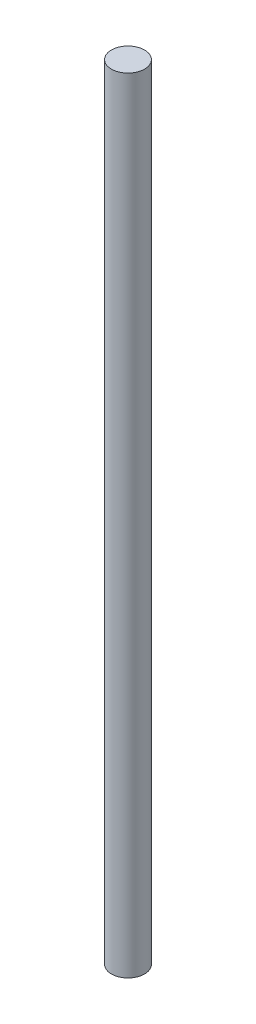
ISO-10303-21;
HEADER;
FILE_DESCRIPTION(('STEP AP214'),'2;1');
FILE_NAME('part.step','',(''),(''),'','','');
FILE_SCHEMA(('AUTOMOTIVE_DESIGN { 1 0 10303 214 1 1 1 1 }'));
ENDSEC;
DATA;
#1=APPLICATION_CONTEXT('core data for automotive mechanical design processes');
#2=APPLICATION_PROTOCOL_DEFINITION('international standard','automotive_design',2000,#1);
#3=PRODUCT_CONTEXT('',#1,'mechanical');
#4=PRODUCT('Part','Part','',(#3));
#5=PRODUCT_RELATED_PRODUCT_CATEGORY('part','',(#4));
#6=PRODUCT_DEFINITION_FORMATION('','',#4);
#7=PRODUCT_DEFINITION_CONTEXT('part definition',#1,'design');
#8=PRODUCT_DEFINITION('design','',#6,#7);
#9=PRODUCT_DEFINITION_SHAPE('','',#8);
#10=(LENGTH_UNIT() NAMED_UNIT(*) SI_UNIT(.MILLI.,.METRE.));
#11=(NAMED_UNIT(*) PLANE_ANGLE_UNIT() SI_UNIT($,.RADIAN.));
#12=(NAMED_UNIT(*) SI_UNIT($,.STERADIAN.) SOLID_ANGLE_UNIT());
#13=UNCERTAINTY_MEASURE_WITH_UNIT(LENGTH_MEASURE(1.E-05),#10,'distance_accuracy_value','');
#14=(GEOMETRIC_REPRESENTATION_CONTEXT(3) GLOBAL_UNCERTAINTY_ASSIGNED_CONTEXT((#13)) GLOBAL_UNIT_ASSIGNED_CONTEXT((#10,
#11,#12)) REPRESENTATION_CONTEXT('',''));
#15=CARTESIAN_POINT('',(0.,0.,0.));
#16=DIRECTION('',(0.,0.,1.));
#17=DIRECTION('',(1.,0.,0.));
#18=AXIS2_PLACEMENT_3D('',#15,#16,#17);
#19=CARTESIAN_POINT('',(0.,150.,0.));
#20=DIRECTION('',(0.,-1.,0.));
#21=DIRECTION('',(0.,0.,-1.));
#22=AXIS2_PLACEMENT_3D('',#19,#20,#21);
#23=CYLINDRICAL_SURFACE('',#22,3.175);
#24=CARTESIAN_POINT('',(0.,150.,0.));
#25=DIRECTION('',(0.,1.,0.));
#26=DIRECTION('',(0.,0.,1.));
#27=AXIS2_PLACEMENT_3D('',#24,#25,#26);
#28=CIRCLE('',#27,3.175);
#29=CARTESIAN_POINT('',(0.,150.,3.175));
#30=VERTEX_POINT('',#29);
#31=EDGE_CURVE('E10',#30,#30,#28,.T.);
#32=ORIENTED_EDGE('',*,*,#31,.F.);
#33=EDGE_LOOP('',(#32));
#34=FACE_BOUND('',#33,.T.);
#35=CARTESIAN_POINT('',(0.,0.,0.));
#36=DIRECTION('',(0.,1.,0.));
#37=DIRECTION('',(0.,0.,1.));
#38=AXIS2_PLACEMENT_3D('',#35,#36,#37);
#39=CIRCLE('',#38,3.175);
#40=CARTESIAN_POINT('',(0.,0.,3.175));
#41=VERTEX_POINT('',#40);
#42=EDGE_CURVE('E34',#41,#41,#39,.T.);
#43=ORIENTED_EDGE('',*,*,#42,.T.);
#44=EDGE_LOOP('',(#43));
#45=FACE_BOUND('',#44,.T.);
#46=ADVANCED_FACE('F31',(#34,#45),#23,.T.);
#47=CARTESIAN_POINT('',(0.,150.,0.));
#48=DIRECTION('',(0.,1.,0.));
#49=DIRECTION('',(0.,0.,1.));
#50=AXIS2_PLACEMENT_3D('',#47,#48,#49);
#51=PLANE('',#50);
#52=ORIENTED_EDGE('',*,*,#31,.T.);
#53=EDGE_LOOP('',(#52));
#54=FACE_BOUND('',#53,.T.);
#55=ADVANCED_FACE('F46',(#54),#51,.T.);
#56=CARTESIAN_POINT('',(0.,0.,0.));
#57=DIRECTION('',(0.,1.,0.));
#58=DIRECTION('',(0.,0.,1.));
#59=AXIS2_PLACEMENT_3D('',#56,#57,#58);
#60=PLANE('',#59);
#61=ORIENTED_EDGE('',*,*,#42,.F.);
#62=EDGE_LOOP('',(#61));
#63=FACE_BOUND('',#62,.T.);
#64=ADVANCED_FACE('F44',(#63),#60,.F.);
#65=CLOSED_SHELL('',(#46,#55,#64));
#66=MANIFOLD_SOLID_BREP('B2',#65);
#67=ADVANCED_BREP_SHAPE_REPRESENTATION('',(#18,#66),#14);
#68=SHAPE_DEFINITION_REPRESENTATION(#9,#67);
ENDSEC;
END-ISO-10303-21;
